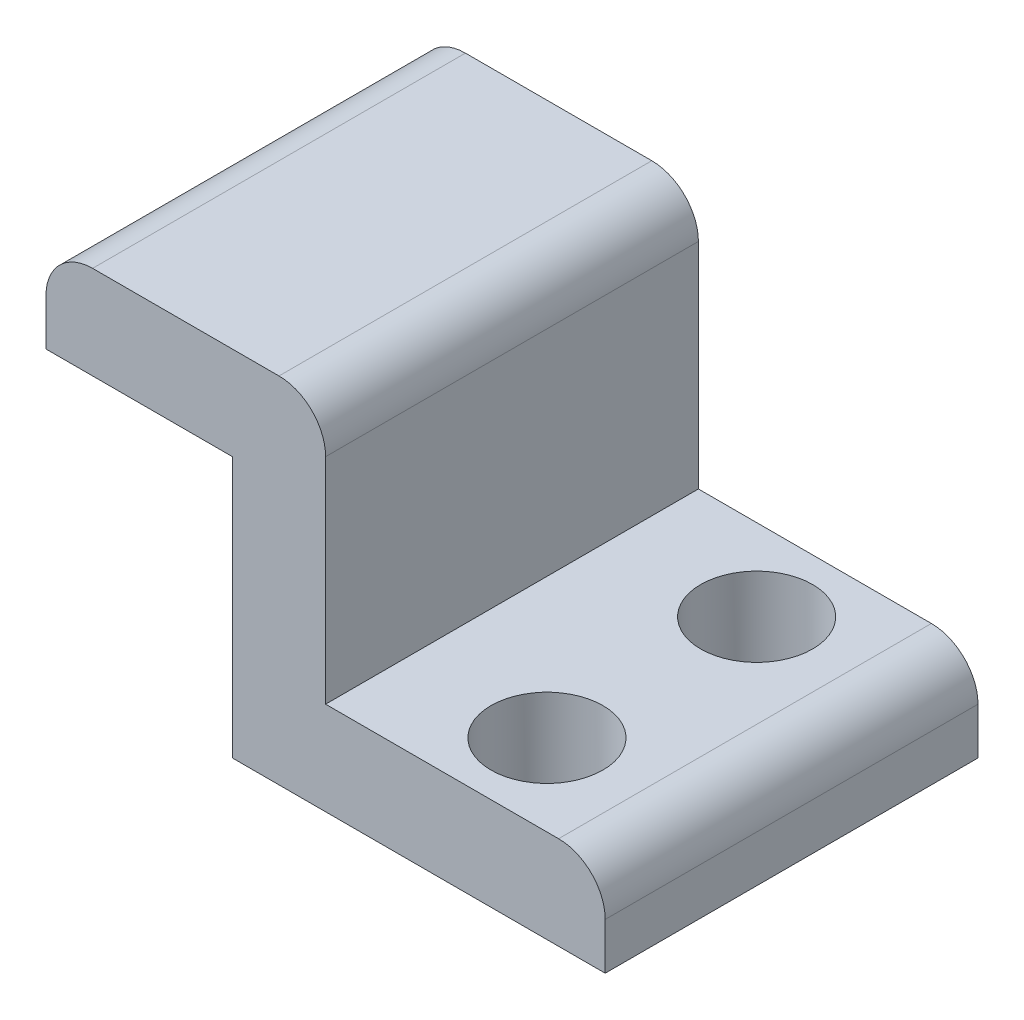
ISO-10303-21;
HEADER;
FILE_DESCRIPTION(('STEP AP214'),'2;1');
FILE_NAME('part.step','',(''),(''),'','','');
FILE_SCHEMA(('AUTOMOTIVE_DESIGN { 1 0 10303 214 1 1 1 1 }'));
ENDSEC;
DATA;
#1=APPLICATION_CONTEXT('core data for automotive mechanical design processes');
#2=APPLICATION_PROTOCOL_DEFINITION('international standard','automotive_design',2000,#1);
#3=PRODUCT_CONTEXT('',#1,'mechanical');
#4=PRODUCT('Part','Part','',(#3));
#5=PRODUCT_RELATED_PRODUCT_CATEGORY('part','',(#4));
#6=PRODUCT_DEFINITION_FORMATION('','',#4);
#7=PRODUCT_DEFINITION_CONTEXT('part definition',#1,'design');
#8=PRODUCT_DEFINITION('design','',#6,#7);
#9=PRODUCT_DEFINITION_SHAPE('','',#8);
#10=(LENGTH_UNIT() NAMED_UNIT(*) SI_UNIT(.MILLI.,.METRE.));
#11=(NAMED_UNIT(*) PLANE_ANGLE_UNIT() SI_UNIT($,.RADIAN.));
#12=(NAMED_UNIT(*) SI_UNIT($,.STERADIAN.) SOLID_ANGLE_UNIT());
#13=UNCERTAINTY_MEASURE_WITH_UNIT(LENGTH_MEASURE(1.E-05),#10,'distance_accuracy_value','');
#14=(GEOMETRIC_REPRESENTATION_CONTEXT(3) GLOBAL_UNCERTAINTY_ASSIGNED_CONTEXT((#13)) GLOBAL_UNIT_ASSIGNED_CONTEXT((#10,
#11,#12)) REPRESENTATION_CONTEXT('',''));
#15=CARTESIAN_POINT('',(0.,0.,0.));
#16=DIRECTION('',(0.,0.,1.));
#17=DIRECTION('',(1.,0.,0.));
#18=AXIS2_PLACEMENT_3D('',#15,#16,#17);
#19=CARTESIAN_POINT('',(0.,5.6,8.));
#20=DIRECTION('',(1.,0.,0.));
#21=DIRECTION('',(0.,0.,-1.));
#22=AXIS2_PLACEMENT_3D('',#19,#20,#21);
#23=PLANE('',#22);
#24=DIRECTION('',(0.,-1.,0.));
#25=VECTOR('',#24,1.);
#26=CARTESIAN_POINT('',(0.,5.6,0.));
#27=LINE('',#26,#25);
#28=CARTESIAN_POINT('',(0.,5.6,0.));
#29=VERTEX_POINT('',#28);
#30=CARTESIAN_POINT('',(0.,0.,0.));
#31=VERTEX_POINT('',#30);
#32=EDGE_CURVE('E148',#29,#31,#27,.T.);
#33=ORIENTED_EDGE('',*,*,#32,.T.);
#34=DIRECTION('',(0.,0.,-1.));
#35=VECTOR('',#34,1.);
#36=CARTESIAN_POINT('',(0.,0.,8.));
#37=LINE('',#36,#35);
#38=CARTESIAN_POINT('',(0.,0.,8.));
#39=VERTEX_POINT('',#38);
#40=EDGE_CURVE('E11',#39,#31,#37,.T.);
#41=ORIENTED_EDGE('',*,*,#40,.F.);
#42=DIRECTION('',(0.,-1.,0.));
#43=VECTOR('',#42,1.);
#44=CARTESIAN_POINT('',(0.,5.6,8.));
#45=LINE('',#44,#43);
#46=CARTESIAN_POINT('',(0.,5.6,8.));
#47=VERTEX_POINT('',#46);
#48=EDGE_CURVE('E168',#47,#39,#45,.T.);
#49=ORIENTED_EDGE('',*,*,#48,.F.);
#50=DIRECTION('',(0.,0.,-1.));
#51=VECTOR('',#50,1.);
#52=CARTESIAN_POINT('',(0.,5.6,8.));
#53=LINE('',#52,#51);
#54=EDGE_CURVE('E144',#47,#29,#53,.T.);
#55=ORIENTED_EDGE('',*,*,#54,.T.);
#56=EDGE_LOOP('',(#33,#41,#49,#55));
#57=FACE_BOUND('',#56,.T.);
#58=ADVANCED_FACE('F33',(#57),#23,.F.);
#59=CARTESIAN_POINT('',(0.,0.,8.));
#60=DIRECTION('',(0.,1.,0.));
#61=DIRECTION('',(0.,0.,1.));
#62=AXIS2_PLACEMENT_3D('',#59,#60,#61);
#63=PLANE('',#62);
#64=CARTESIAN_POINT('',(5.,0.,6.25));
#65=DIRECTION('',(0.,1.,0.));
#66=DIRECTION('',(0.,0.,1.));
#67=AXIS2_PLACEMENT_3D('',#64,#65,#66);
#68=CIRCLE('',#67,1.2);
#69=CARTESIAN_POINT('',(5.,0.,7.45));
#70=VERTEX_POINT('',#69);
#71=EDGE_CURVE('E332',#70,#70,#68,.T.);
#72=ORIENTED_EDGE('',*,*,#71,.T.);
#73=EDGE_LOOP('',(#72));
#74=FACE_BOUND('',#73,.T.);
#75=CARTESIAN_POINT('',(5.,0.,1.75));
#76=DIRECTION('',(0.,1.,0.));
#77=DIRECTION('',(0.,0.,1.));
#78=AXIS2_PLACEMENT_3D('',#75,#76,#77);
#79=CIRCLE('',#78,1.2);
#80=CARTESIAN_POINT('',(5.,0.,2.95));
#81=VERTEX_POINT('',#80);
#82=EDGE_CURVE('E336',#81,#81,#79,.T.);
#83=ORIENTED_EDGE('',*,*,#82,.T.);
#84=EDGE_LOOP('',(#83));
#85=FACE_BOUND('',#84,.T.);
#86=DIRECTION('',(1.,0.,0.));
#87=VECTOR('',#86,1.);
#88=CARTESIAN_POINT('',(0.,0.,0.));
#89=LINE('',#88,#87);
#90=CARTESIAN_POINT('',(8.,0.,0.));
#91=VERTEX_POINT('',#90);
#92=EDGE_CURVE('E151',#31,#91,#89,.T.);
#93=ORIENTED_EDGE('',*,*,#92,.T.);
#94=DIRECTION('',(0.,0.,-1.));
#95=VECTOR('',#94,1.);
#96=CARTESIAN_POINT('',(8.,0.,8.));
#97=LINE('',#96,#95);
#98=CARTESIAN_POINT('',(8.,0.,8.));
#99=VERTEX_POINT('',#98);
#100=EDGE_CURVE('E42',#99,#91,#97,.T.);
#101=ORIENTED_EDGE('',*,*,#100,.F.);
#102=DIRECTION('',(1.,0.,0.));
#103=VECTOR('',#102,1.);
#104=CARTESIAN_POINT('',(0.,0.,8.));
#105=LINE('',#104,#103);
#106=EDGE_CURVE('E102',#39,#99,#105,.T.);
#107=ORIENTED_EDGE('',*,*,#106,.F.);
#108=ORIENTED_EDGE('',*,*,#40,.T.);
#109=EDGE_LOOP('',(#93,#101,#107,#108));
#110=FACE_BOUND('',#109,.T.);
#111=ADVANCED_FACE('F241',(#74,#85,#110),#63,.F.);
#112=CARTESIAN_POINT('',(8.,0.,8.));
#113=DIRECTION('',(-1.,0.,0.));
#114=DIRECTION('',(0.,-1.,0.));
#115=AXIS2_PLACEMENT_3D('',#112,#113,#114);
#116=PLANE('',#115);
#117=DIRECTION('',(0.,1.,0.));
#118=VECTOR('',#117,1.);
#119=CARTESIAN_POINT('',(8.,0.,0.));
#120=LINE('',#119,#118);
#121=CARTESIAN_POINT('',(8.,1.,0.));
#122=VERTEX_POINT('',#121);
#123=EDGE_CURVE('E153',#91,#122,#120,.T.);
#124=ORIENTED_EDGE('',*,*,#123,.T.);
#125=DIRECTION('',(0.,0.,-1.));
#126=VECTOR('',#125,1.);
#127=CARTESIAN_POINT('',(8.,1.,8.));
#128=LINE('',#127,#126);
#129=CARTESIAN_POINT('',(8.,1.,8.));
#130=VERTEX_POINT('',#129);
#131=EDGE_CURVE('E184',#130,#122,#128,.T.);
#132=ORIENTED_EDGE('',*,*,#131,.F.);
#133=DIRECTION('',(0.,1.,0.));
#134=VECTOR('',#133,1.);
#135=CARTESIAN_POINT('',(8.,0.,8.));
#136=LINE('',#135,#134);
#137=EDGE_CURVE('E193',#99,#130,#136,.T.);
#138=ORIENTED_EDGE('',*,*,#137,.F.);
#139=ORIENTED_EDGE('',*,*,#100,.T.);
#140=EDGE_LOOP('',(#124,#132,#138,#139));
#141=FACE_BOUND('',#140,.T.);
#142=ADVANCED_FACE('F191',(#141),#116,.F.);
#143=CARTESIAN_POINT('',(7.,1.,8.));
#144=DIRECTION('',(0.,0.,-1.));
#145=DIRECTION('',(-1.,0.,0.));
#146=AXIS2_PLACEMENT_3D('',#143,#144,#145);
#147=CYLINDRICAL_SURFACE('',#146,0.999999999999999);
#148=CARTESIAN_POINT('',(7.,1.,0.));
#149=DIRECTION('',(0.,0.,1.));
#150=DIRECTION('',(1.,0.,0.));
#151=AXIS2_PLACEMENT_3D('',#148,#149,#150);
#152=CIRCLE('',#151,0.999999999999999);
#153=CARTESIAN_POINT('',(7.,2.,0.));
#154=VERTEX_POINT('',#153);
#155=EDGE_CURVE('E155',#122,#154,#152,.T.);
#156=ORIENTED_EDGE('',*,*,#155,.T.);
#157=DIRECTION('',(0.,0.,-1.));
#158=VECTOR('',#157,1.);
#159=CARTESIAN_POINT('',(7.,2.,8.));
#160=LINE('',#159,#158);
#161=CARTESIAN_POINT('',(7.,2.,8.));
#162=VERTEX_POINT('',#161);
#163=EDGE_CURVE('E181',#162,#154,#160,.T.);
#164=ORIENTED_EDGE('',*,*,#163,.F.);
#165=CARTESIAN_POINT('',(7.,1.,8.));
#166=DIRECTION('',(0.,0.,1.));
#167=DIRECTION('',(1.,0.,0.));
#168=AXIS2_PLACEMENT_3D('',#165,#166,#167);
#169=CIRCLE('',#168,0.999999999999999);
#170=EDGE_CURVE('E211',#130,#162,#169,.T.);
#171=ORIENTED_EDGE('',*,*,#170,.F.);
#172=ORIENTED_EDGE('',*,*,#131,.T.);
#173=EDGE_LOOP('',(#156,#164,#171,#172));
#174=FACE_BOUND('',#173,.T.);
#175=ADVANCED_FACE('F202',(#174),#147,.T.);
#176=CARTESIAN_POINT('',(7.,2.,8.));
#177=DIRECTION('',(0.,-1.,0.));
#178=DIRECTION('',(0.,0.,-1.));
#179=AXIS2_PLACEMENT_3D('',#176,#177,#178);
#180=PLANE('',#179);
#181=CARTESIAN_POINT('',(5.,2.,6.25));
#182=DIRECTION('',(0.,-1.,0.));
#183=DIRECTION('',(0.,0.,-1.));
#184=AXIS2_PLACEMENT_3D('',#181,#182,#183);
#185=CIRCLE('',#184,1.2);
#186=CARTESIAN_POINT('',(5.,2.,5.05));
#187=VERTEX_POINT('',#186);
#188=EDGE_CURVE('E335',#187,#187,#185,.T.);
#189=ORIENTED_EDGE('',*,*,#188,.T.);
#190=EDGE_LOOP('',(#189));
#191=FACE_BOUND('',#190,.T.);
#192=CARTESIAN_POINT('',(5.,2.,1.75));
#193=DIRECTION('',(0.,-1.,0.));
#194=DIRECTION('',(0.,0.,-1.));
#195=AXIS2_PLACEMENT_3D('',#192,#193,#194);
#196=CIRCLE('',#195,1.2);
#197=CARTESIAN_POINT('',(5.,2.,0.550000000000002));
#198=VERTEX_POINT('',#197);
#199=EDGE_CURVE('E36',#198,#198,#196,.T.);
#200=ORIENTED_EDGE('',*,*,#199,.T.);
#201=EDGE_LOOP('',(#200));
#202=FACE_BOUND('',#201,.T.);
#203=DIRECTION('',(-1.,0.,0.));
#204=VECTOR('',#203,1.);
#205=CARTESIAN_POINT('',(7.,2.,0.));
#206=LINE('',#205,#204);
#207=CARTESIAN_POINT('',(2.,2.,0.));
#208=VERTEX_POINT('',#207);
#209=EDGE_CURVE('E157',#154,#208,#206,.T.);
#210=ORIENTED_EDGE('',*,*,#209,.T.);
#211=DIRECTION('',(0.,0.,-1.));
#212=VECTOR('',#211,1.);
#213=CARTESIAN_POINT('',(2.,2.,8.));
#214=LINE('',#213,#212);
#215=CARTESIAN_POINT('',(2.,2.,8.));
#216=VERTEX_POINT('',#215);
#217=EDGE_CURVE('E178',#216,#208,#214,.T.);
#218=ORIENTED_EDGE('',*,*,#217,.F.);
#219=DIRECTION('',(-1.,0.,0.));
#220=VECTOR('',#219,1.);
#221=CARTESIAN_POINT('',(7.,2.,8.));
#222=LINE('',#221,#220);
#223=EDGE_CURVE('E208',#162,#216,#222,.T.);
#224=ORIENTED_EDGE('',*,*,#223,.F.);
#225=ORIENTED_EDGE('',*,*,#163,.T.);
#226=EDGE_LOOP('',(#210,#218,#224,#225));
#227=FACE_BOUND('',#226,.T.);
#228=ADVANCED_FACE('F206',(#191,#202,#227),#180,.F.);
#229=CARTESIAN_POINT('',(2.,2.,8.));
#230=DIRECTION('',(-1.,0.,0.));
#231=DIRECTION('',(0.,-1.,0.));
#232=AXIS2_PLACEMENT_3D('',#229,#230,#231);
#233=PLANE('',#232);
#234=DIRECTION('',(0.,1.,0.));
#235=VECTOR('',#234,1.);
#236=CARTESIAN_POINT('',(2.,2.,0.));
#237=LINE('',#236,#235);
#238=CARTESIAN_POINT('',(2.,6.6,0.));
#239=VERTEX_POINT('',#238);
#240=EDGE_CURVE('E159',#208,#239,#237,.T.);
#241=ORIENTED_EDGE('',*,*,#240,.T.);
#242=DIRECTION('',(0.,0.,-1.));
#243=VECTOR('',#242,1.);
#244=CARTESIAN_POINT('',(2.,6.6,8.));
#245=LINE('',#244,#243);
#246=CARTESIAN_POINT('',(2.,6.6,8.));
#247=VERTEX_POINT('',#246);
#248=EDGE_CURVE('E175',#247,#239,#245,.T.);
#249=ORIENTED_EDGE('',*,*,#248,.F.);
#250=DIRECTION('',(0.,1.,0.));
#251=VECTOR('',#250,1.);
#252=CARTESIAN_POINT('',(2.,2.,8.));
#253=LINE('',#252,#251);
#254=EDGE_CURVE('E210',#216,#247,#253,.T.);
#255=ORIENTED_EDGE('',*,*,#254,.F.);
#256=ORIENTED_EDGE('',*,*,#217,.T.);
#257=EDGE_LOOP('',(#241,#249,#255,#256));
#258=FACE_BOUND('',#257,.T.);
#259=ADVANCED_FACE('F257',(#258),#233,.F.);
#260=CARTESIAN_POINT('',(1.,6.6,8.));
#261=DIRECTION('',(0.,0.,-1.));
#262=DIRECTION('',(-1.,0.,0.));
#263=AXIS2_PLACEMENT_3D('',#260,#261,#262);
#264=CYLINDRICAL_SURFACE('',#263,1.);
#265=CARTESIAN_POINT('',(1.,6.6,0.));
#266=DIRECTION('',(0.,0.,1.));
#267=DIRECTION('',(1.,0.,0.));
#268=AXIS2_PLACEMENT_3D('',#265,#266,#267);
#269=CIRCLE('',#268,1.);
#270=CARTESIAN_POINT('',(1.,7.6,0.));
#271=VERTEX_POINT('',#270);
#272=EDGE_CURVE('E161',#239,#271,#269,.T.);
#273=ORIENTED_EDGE('',*,*,#272,.T.);
#274=DIRECTION('',(0.,0.,-1.));
#275=VECTOR('',#274,1.);
#276=CARTESIAN_POINT('',(1.,7.6,8.));
#277=LINE('',#276,#275);
#278=CARTESIAN_POINT('',(1.,7.6,8.));
#279=VERTEX_POINT('',#278);
#280=EDGE_CURVE('E172',#279,#271,#277,.T.);
#281=ORIENTED_EDGE('',*,*,#280,.F.);
#282=CARTESIAN_POINT('',(1.,6.6,8.));
#283=DIRECTION('',(0.,0.,1.));
#284=DIRECTION('',(1.,0.,0.));
#285=AXIS2_PLACEMENT_3D('',#282,#283,#284);
#286=CIRCLE('',#285,1.);
#287=EDGE_CURVE('E213',#247,#279,#286,.T.);
#288=ORIENTED_EDGE('',*,*,#287,.F.);
#289=ORIENTED_EDGE('',*,*,#248,.T.);
#290=EDGE_LOOP('',(#273,#281,#288,#289));
#291=FACE_BOUND('',#290,.T.);
#292=ADVANCED_FACE('F222',(#291),#264,.T.);
#293=CARTESIAN_POINT('',(1.,7.6,8.));
#294=DIRECTION('',(0.,-1.,0.));
#295=DIRECTION('',(1.,0.,0.));
#296=AXIS2_PLACEMENT_3D('',#293,#294,#295);
#297=PLANE('',#296);
#298=DIRECTION('',(-1.,0.,0.));
#299=VECTOR('',#298,1.);
#300=CARTESIAN_POINT('',(1.,7.6,0.));
#301=LINE('',#300,#299);
#302=CARTESIAN_POINT('',(-3.,7.6,0.));
#303=VERTEX_POINT('',#302);
#304=EDGE_CURVE('E163',#271,#303,#301,.T.);
#305=ORIENTED_EDGE('',*,*,#304,.T.);
#306=DIRECTION('',(0.,0.,-1.));
#307=VECTOR('',#306,1.);
#308=CARTESIAN_POINT('',(-3.,7.6,8.));
#309=LINE('',#308,#307);
#310=CARTESIAN_POINT('',(-3.,7.6,8.));
#311=VERTEX_POINT('',#310);
#312=EDGE_CURVE('E139',#311,#303,#309,.T.);
#313=ORIENTED_EDGE('',*,*,#312,.F.);
#314=DIRECTION('',(-1.,0.,0.));
#315=VECTOR('',#314,1.);
#316=CARTESIAN_POINT('',(1.,7.6,8.));
#317=LINE('',#316,#315);
#318=EDGE_CURVE('E130',#279,#311,#317,.T.);
#319=ORIENTED_EDGE('',*,*,#318,.F.);
#320=ORIENTED_EDGE('',*,*,#280,.T.);
#321=EDGE_LOOP('',(#305,#313,#319,#320));
#322=FACE_BOUND('',#321,.T.);
#323=ADVANCED_FACE('F226',(#322),#297,.F.);
#324=CARTESIAN_POINT('',(-3.,6.6,8.));
#325=DIRECTION('',(0.,0.,-1.));
#326=DIRECTION('',(-1.,0.,0.));
#327=AXIS2_PLACEMENT_3D('',#324,#325,#326);
#328=CYLINDRICAL_SURFACE('',#327,0.999999999999999);
#329=CARTESIAN_POINT('',(-3.,6.6,0.));
#330=DIRECTION('',(0.,0.,1.));
#331=DIRECTION('',(1.,0.,0.));
#332=AXIS2_PLACEMENT_3D('',#329,#330,#331);
#333=CIRCLE('',#332,0.999999999999999);
#334=CARTESIAN_POINT('',(-4.,6.6,0.));
#335=VERTEX_POINT('',#334);
#336=EDGE_CURVE('E138',#303,#335,#333,.T.);
#337=ORIENTED_EDGE('',*,*,#336,.T.);
#338=DIRECTION('',(0.,0.,-1.));
#339=VECTOR('',#338,1.);
#340=CARTESIAN_POINT('',(-4.,6.6,8.));
#341=LINE('',#340,#339);
#342=CARTESIAN_POINT('',(-4.,6.6,8.));
#343=VERTEX_POINT('',#342);
#344=EDGE_CURVE('E135',#343,#335,#341,.T.);
#345=ORIENTED_EDGE('',*,*,#344,.F.);
#346=CARTESIAN_POINT('',(-3.,6.6,8.));
#347=DIRECTION('',(0.,0.,1.));
#348=DIRECTION('',(1.,0.,0.));
#349=AXIS2_PLACEMENT_3D('',#346,#347,#348);
#350=CIRCLE('',#349,0.999999999999999);
#351=EDGE_CURVE('E124',#311,#343,#350,.T.);
#352=ORIENTED_EDGE('',*,*,#351,.F.);
#353=ORIENTED_EDGE('',*,*,#312,.T.);
#354=EDGE_LOOP('',(#337,#345,#352,#353));
#355=FACE_BOUND('',#354,.T.);
#356=ADVANCED_FACE('F136',(#355),#328,.T.);
#357=CARTESIAN_POINT('',(-4.,6.6,8.));
#358=DIRECTION('',(1.,0.,0.));
#359=DIRECTION('',(0.,0.,-1.));
#360=AXIS2_PLACEMENT_3D('',#357,#358,#359);
#361=PLANE('',#360);
#362=DIRECTION('',(0.,-1.,0.));
#363=VECTOR('',#362,1.);
#364=CARTESIAN_POINT('',(-4.,6.6,0.));
#365=LINE('',#364,#363);
#366=CARTESIAN_POINT('',(-4.,5.6,0.));
#367=VERTEX_POINT('',#366);
#368=EDGE_CURVE('E88',#335,#367,#365,.T.);
#369=ORIENTED_EDGE('',*,*,#368,.T.);
#370=DIRECTION('',(0.,0.,-1.));
#371=VECTOR('',#370,1.);
#372=CARTESIAN_POINT('',(-4.,5.6,8.));
#373=LINE('',#372,#371);
#374=CARTESIAN_POINT('',(-4.,5.6,8.));
#375=VERTEX_POINT('',#374);
#376=EDGE_CURVE('E140',#375,#367,#373,.T.);
#377=ORIENTED_EDGE('',*,*,#376,.F.);
#378=DIRECTION('',(0.,-1.,0.));
#379=VECTOR('',#378,1.);
#380=CARTESIAN_POINT('',(-4.,6.6,8.));
#381=LINE('',#380,#379);
#382=EDGE_CURVE('E128',#343,#375,#381,.T.);
#383=ORIENTED_EDGE('',*,*,#382,.F.);
#384=ORIENTED_EDGE('',*,*,#344,.T.);
#385=EDGE_LOOP('',(#369,#377,#383,#384));
#386=FACE_BOUND('',#385,.T.);
#387=ADVANCED_FACE('F142',(#386),#361,.F.);
#388=CARTESIAN_POINT('',(-4.,5.6,8.));
#389=DIRECTION('',(0.,1.,0.));
#390=DIRECTION('',(-1.,0.,0.));
#391=AXIS2_PLACEMENT_3D('',#388,#389,#390);
#392=PLANE('',#391);
#393=DIRECTION('',(1.,0.,0.));
#394=VECTOR('',#393,1.);
#395=CARTESIAN_POINT('',(-4.,5.6,0.));
#396=LINE('',#395,#394);
#397=EDGE_CURVE('E94',#367,#29,#396,.T.);
#398=ORIENTED_EDGE('',*,*,#397,.T.);
#399=ORIENTED_EDGE('',*,*,#54,.F.);
#400=DIRECTION('',(1.,0.,0.));
#401=VECTOR('',#400,1.);
#402=CARTESIAN_POINT('',(-4.,5.6,8.));
#403=LINE('',#402,#401);
#404=EDGE_CURVE('E50',#375,#47,#403,.T.);
#405=ORIENTED_EDGE('',*,*,#404,.F.);
#406=ORIENTED_EDGE('',*,*,#376,.T.);
#407=EDGE_LOOP('',(#398,#399,#405,#406));
#408=FACE_BOUND('',#407,.T.);
#409=ADVANCED_FACE('F230',(#408),#392,.F.);
#410=CARTESIAN_POINT('',(7.,1.,8.));
#411=DIRECTION('',(0.,0.,1.));
#412=DIRECTION('',(1.,0.,0.));
#413=AXIS2_PLACEMENT_3D('',#410,#411,#412);
#414=PLANE('',#413);
#415=ORIENTED_EDGE('',*,*,#48,.T.);
#416=ORIENTED_EDGE('',*,*,#106,.T.);
#417=ORIENTED_EDGE('',*,*,#137,.T.);
#418=ORIENTED_EDGE('',*,*,#170,.T.);
#419=ORIENTED_EDGE('',*,*,#223,.T.);
#420=ORIENTED_EDGE('',*,*,#254,.T.);
#421=ORIENTED_EDGE('',*,*,#287,.T.);
#422=ORIENTED_EDGE('',*,*,#318,.T.);
#423=ORIENTED_EDGE('',*,*,#351,.T.);
#424=ORIENTED_EDGE('',*,*,#382,.T.);
#425=ORIENTED_EDGE('',*,*,#404,.T.);
#426=EDGE_LOOP('',(#415,#416,#417,#418,#419,#420,#421,#422,#423,#424,#425));
#427=FACE_BOUND('',#426,.T.);
#428=ADVANCED_FACE('F126',(#427),#414,.T.);
#429=CARTESIAN_POINT('',(7.,1.,0.));
#430=DIRECTION('',(0.,0.,1.));
#431=DIRECTION('',(1.,0.,0.));
#432=AXIS2_PLACEMENT_3D('',#429,#430,#431);
#433=PLANE('',#432);
#434=ORIENTED_EDGE('',*,*,#32,.F.);
#435=ORIENTED_EDGE('',*,*,#397,.F.);
#436=ORIENTED_EDGE('',*,*,#368,.F.);
#437=ORIENTED_EDGE('',*,*,#336,.F.);
#438=ORIENTED_EDGE('',*,*,#304,.F.);
#439=ORIENTED_EDGE('',*,*,#272,.F.);
#440=ORIENTED_EDGE('',*,*,#240,.F.);
#441=ORIENTED_EDGE('',*,*,#209,.F.);
#442=ORIENTED_EDGE('',*,*,#155,.F.);
#443=ORIENTED_EDGE('',*,*,#123,.F.);
#444=ORIENTED_EDGE('',*,*,#92,.F.);
#445=EDGE_LOOP('',(#434,#435,#436,#437,#438,#439,#440,#441,#442,#443,#444));
#446=FACE_BOUND('',#445,.T.);
#447=ADVANCED_FACE('F197',(#446),#433,.F.);
#448=CARTESIAN_POINT('',(5.,12.,1.75));
#449=DIRECTION('',(0.,1.,0.));
#450=DIRECTION('',(0.,0.,1.));
#451=AXIS2_PLACEMENT_3D('',#448,#449,#450);
#452=CYLINDRICAL_SURFACE('',#451,1.2);
#453=ORIENTED_EDGE('',*,*,#82,.F.);
#454=EDGE_LOOP('',(#453));
#455=FACE_BOUND('',#454,.T.);
#456=ORIENTED_EDGE('',*,*,#199,.F.);
#457=EDGE_LOOP('',(#456));
#458=FACE_BOUND('',#457,.T.);
#459=ADVANCED_FACE('F294',(#455,#458),#452,.F.);
#460=CARTESIAN_POINT('',(5.,12.,6.25));
#461=DIRECTION('',(0.,1.,0.));
#462=DIRECTION('',(0.,0.,1.));
#463=AXIS2_PLACEMENT_3D('',#460,#461,#462);
#464=CYLINDRICAL_SURFACE('',#463,1.2);
#465=ORIENTED_EDGE('',*,*,#71,.F.);
#466=EDGE_LOOP('',(#465));
#467=FACE_BOUND('',#466,.T.);
#468=ORIENTED_EDGE('',*,*,#188,.F.);
#469=EDGE_LOOP('',(#468));
#470=FACE_BOUND('',#469,.T.);
#471=ADVANCED_FACE('F301',(#467,#470),#464,.F.);
#472=CLOSED_SHELL('',(#58,#111,#142,#175,#228,#259,#292,#323,#356,#387,#409,#428,#447,#459,#471));
#473=MANIFOLD_SOLID_BREP('B2',#472);
#474=ADVANCED_BREP_SHAPE_REPRESENTATION('',(#18,#473),#14);
#475=SHAPE_DEFINITION_REPRESENTATION(#9,#474);
ENDSEC;
END-ISO-10303-21;
